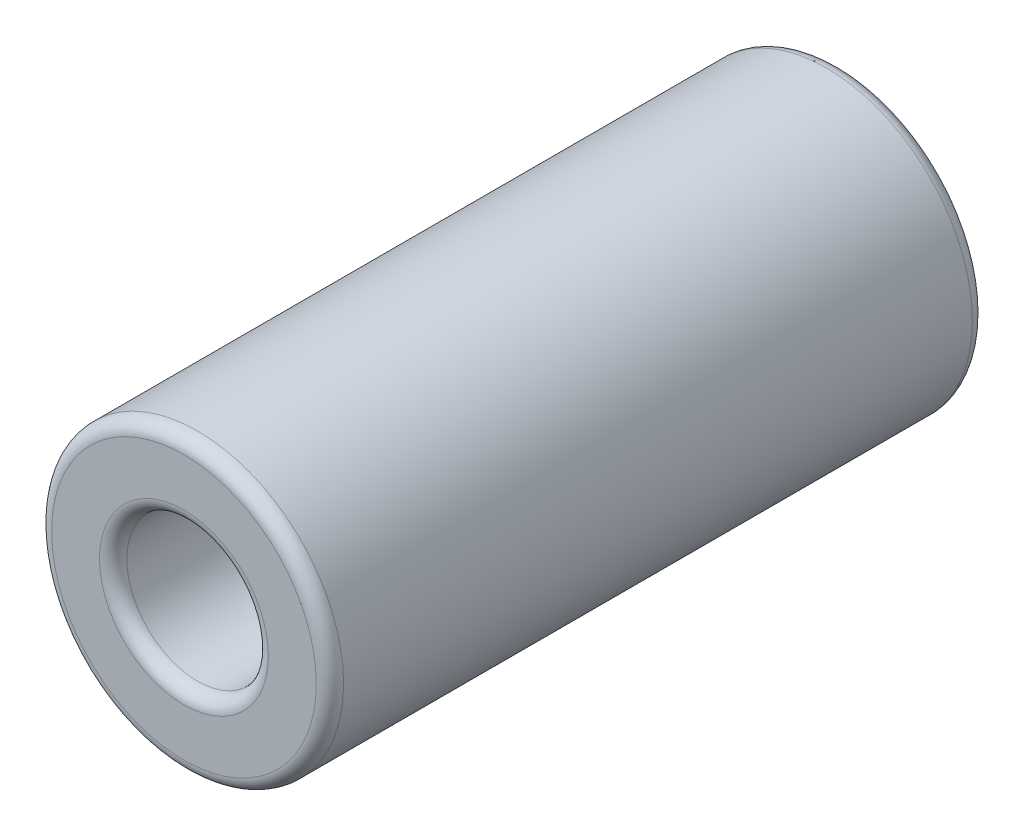
ISO-10303-21;
HEADER;
FILE_DESCRIPTION(('STEP AP214'),'2;1');
FILE_NAME('part.step','',(''),(''),'','','');
FILE_SCHEMA(('AUTOMOTIVE_DESIGN { 1 0 10303 214 1 1 1 1 }'));
ENDSEC;
DATA;
#1=APPLICATION_CONTEXT('core data for automotive mechanical design processes');
#2=APPLICATION_PROTOCOL_DEFINITION('international standard','automotive_design',2000,#1);
#3=PRODUCT_CONTEXT('',#1,'mechanical');
#4=PRODUCT('Part','Part','',(#3));
#5=PRODUCT_RELATED_PRODUCT_CATEGORY('part','',(#4));
#6=PRODUCT_DEFINITION_FORMATION('','',#4);
#7=PRODUCT_DEFINITION_CONTEXT('part definition',#1,'design');
#8=PRODUCT_DEFINITION('design','',#6,#7);
#9=PRODUCT_DEFINITION_SHAPE('','',#8);
#10=(LENGTH_UNIT() NAMED_UNIT(*) SI_UNIT(.MILLI.,.METRE.));
#11=(NAMED_UNIT(*) PLANE_ANGLE_UNIT() SI_UNIT($,.RADIAN.));
#12=(NAMED_UNIT(*) SI_UNIT($,.STERADIAN.) SOLID_ANGLE_UNIT());
#13=UNCERTAINTY_MEASURE_WITH_UNIT(LENGTH_MEASURE(1.E-05),#10,'distance_accuracy_value','');
#14=(GEOMETRIC_REPRESENTATION_CONTEXT(3) GLOBAL_UNCERTAINTY_ASSIGNED_CONTEXT((#13)) GLOBAL_UNIT_ASSIGNED_CONTEXT((#10,
#11,#12)) REPRESENTATION_CONTEXT('',''));
#15=CARTESIAN_POINT('',(0.,0.,0.));
#16=DIRECTION('',(0.,0.,1.));
#17=DIRECTION('',(1.,0.,0.));
#18=AXIS2_PLACEMENT_3D('',#15,#16,#17);
#19=CARTESIAN_POINT('',(2.16493489801906E-12,1.42247325030098E-13,33.5999999999999));
#20=DIRECTION('',(0.,0.,1.));
#21=DIRECTION('',(1.,0.,0.));
#22=AXIS2_PLACEMENT_3D('',#19,#20,#21);
#23=PLANE('',#22);
#24=CARTESIAN_POINT('',(2.16493489801906E-12,1.42247325030098E-13,33.5999999999999));
#25=DIRECTION('',(0.,0.,1.));
#26=DIRECTION('',(1.,0.,0.));
#27=AXIS2_PLACEMENT_3D('',#24,#25,#26);
#28=CIRCLE('',#27,4.325);
#29=CARTESIAN_POINT('',(4.32500000000217,1.42247325030098E-13,33.5999999999999));
#30=VERTEX_POINT('',#29);
#31=EDGE_CURVE('E10',#30,#30,#28,.F.);
#32=ORIENTED_EDGE('',*,*,#31,.T.);
#33=EDGE_LOOP('',(#32));
#34=FACE_BOUND('',#33,.T.);
#35=CARTESIAN_POINT('',(2.16493489801906E-12,1.42247325030098E-13,33.5999999999999));
#36=DIRECTION('',(0.,0.,1.));
#37=DIRECTION('',(1.,0.,0.));
#38=AXIS2_PLACEMENT_3D('',#35,#36,#37);
#39=CIRCLE('',#38,6.775);
#40=CARTESIAN_POINT('',(6.77500000000217,1.42247325030098E-13,33.5999999999999));
#41=VERTEX_POINT('',#40);
#42=EDGE_CURVE('E39',#41,#41,#39,.T.);
#43=ORIENTED_EDGE('',*,*,#42,.T.);
#44=EDGE_LOOP('',(#43));
#45=FACE_BOUND('',#44,.T.);
#46=ADVANCED_FACE('F32',(#34,#45),#23,.T.);
#47=CARTESIAN_POINT('',(2.4980018054066E-12,0.,0.));
#48=DIRECTION('',(0.,0.,1.));
#49=DIRECTION('',(1.,0.,0.));
#50=AXIS2_PLACEMENT_3D('',#47,#48,#49);
#51=PLANE('',#50);
#52=CARTESIAN_POINT('',(2.4980018054066E-12,0.,0.));
#53=DIRECTION('',(0.,0.,1.));
#54=DIRECTION('',(1.,0.,0.));
#55=AXIS2_PLACEMENT_3D('',#52,#53,#54);
#56=CIRCLE('',#55,4.325);
#57=CARTESIAN_POINT('',(4.3250000000025,0.,0.));
#58=VERTEX_POINT('',#57);
#59=EDGE_CURVE('E58',#58,#58,#56,.T.);
#60=ORIENTED_EDGE('',*,*,#59,.T.);
#61=EDGE_LOOP('',(#60));
#62=FACE_BOUND('',#61,.T.);
#63=CARTESIAN_POINT('',(2.4980018054066E-12,0.,0.));
#64=DIRECTION('',(0.,0.,1.));
#65=DIRECTION('',(1.,0.,0.));
#66=AXIS2_PLACEMENT_3D('',#63,#64,#65);
#67=CIRCLE('',#66,6.775);
#68=CARTESIAN_POINT('',(6.77500000000251,0.,0.));
#69=VERTEX_POINT('',#68);
#70=EDGE_CURVE('E61',#69,#69,#67,.F.);
#71=ORIENTED_EDGE('',*,*,#70,.T.);
#72=EDGE_LOOP('',(#71));
#73=FACE_BOUND('',#72,.T.);
#74=ADVANCED_FACE('F65',(#62,#73),#51,.F.);
#75=CARTESIAN_POINT('',(2.16493489801906E-12,1.42247325030098E-13,33.5999999999999));
#76=DIRECTION('',(0.,0.,-1.));
#77=DIRECTION('',(-1.,0.,0.));
#78=AXIS2_PLACEMENT_3D('',#75,#76,#77);
#79=CYLINDRICAL_SURFACE('',#78,7.475);
#80=CARTESIAN_POINT('',(2.4980018054066E-12,0.,0.699999999999978));
#81=DIRECTION('',(0.,0.,1.));
#82=DIRECTION('',(1.,0.,0.));
#83=AXIS2_PLACEMENT_3D('',#80,#81,#82);
#84=CIRCLE('',#83,7.475);
#85=CARTESIAN_POINT('',(7.47500000000251,0.,0.699999999999978));
#86=VERTEX_POINT('',#85);
#87=EDGE_CURVE('E43',#86,#86,#84,.T.);
#88=ORIENTED_EDGE('',*,*,#87,.T.);
#89=EDGE_LOOP('',(#88));
#90=FACE_BOUND('',#89,.T.);
#91=CARTESIAN_POINT('',(2.16493489801906E-12,0.,32.9));
#92=DIRECTION('',(0.,0.,1.));
#93=DIRECTION('',(1.,0.,0.));
#94=AXIS2_PLACEMENT_3D('',#91,#92,#93);
#95=CIRCLE('',#94,7.475);
#96=CARTESIAN_POINT('',(7.47500000000217,0.,32.9));
#97=VERTEX_POINT('',#96);
#98=EDGE_CURVE('E47',#97,#97,#95,.F.);
#99=ORIENTED_EDGE('',*,*,#98,.T.);
#100=EDGE_LOOP('',(#99));
#101=FACE_BOUND('',#100,.T.);
#102=ADVANCED_FACE('F75',(#90,#101),#79,.T.);
#103=CARTESIAN_POINT('',(2.16493489801906E-12,1.42247325030098E-13,33.5999999999999));
#104=DIRECTION('',(0.,0.,-1.));
#105=DIRECTION('',(-1.,0.,0.));
#106=AXIS2_PLACEMENT_3D('',#103,#104,#105);
#107=CYLINDRICAL_SURFACE('',#106,3.625);
#108=CARTESIAN_POINT('',(2.4980018054066E-12,0.,0.699999999999978));
#109=DIRECTION('',(0.,0.,1.));
#110=DIRECTION('',(1.,0.,0.));
#111=AXIS2_PLACEMENT_3D('',#108,#109,#110);
#112=CIRCLE('',#111,3.625);
#113=CARTESIAN_POINT('',(3.6250000000025,0.,0.699999999999978));
#114=VERTEX_POINT('',#113);
#115=EDGE_CURVE('E52',#114,#114,#112,.F.);
#116=ORIENTED_EDGE('',*,*,#115,.T.);
#117=EDGE_LOOP('',(#116));
#118=FACE_BOUND('',#117,.T.);
#119=CARTESIAN_POINT('',(2.16493489801906E-12,0.,32.9));
#120=DIRECTION('',(0.,0.,1.));
#121=DIRECTION('',(1.,0.,0.));
#122=AXIS2_PLACEMENT_3D('',#119,#120,#121);
#123=CIRCLE('',#122,3.625);
#124=CARTESIAN_POINT('',(3.62500000000217,0.,32.9));
#125=VERTEX_POINT('',#124);
#126=EDGE_CURVE('E55',#125,#125,#123,.T.);
#127=ORIENTED_EDGE('',*,*,#126,.T.);
#128=EDGE_LOOP('',(#127));
#129=FACE_BOUND('',#128,.T.);
#130=ADVANCED_FACE('F78',(#118,#129),#107,.F.);
#131=CARTESIAN_POINT('',(2.4980018054066E-12,0.,0.699999999999978));
#132=DIRECTION('',(0.,0.,1.));
#133=DIRECTION('',(1.,0.,0.));
#134=AXIS2_PLACEMENT_3D('',#131,#132,#133);
#135=TOROIDAL_SURFACE('',#134,4.325,0.7);
#136=ORIENTED_EDGE('',*,*,#115,.F.);
#137=EDGE_LOOP('',(#136));
#138=FACE_BOUND('',#137,.T.);
#139=ORIENTED_EDGE('',*,*,#59,.F.);
#140=EDGE_LOOP('',(#139));
#141=FACE_BOUND('',#140,.T.);
#142=ADVANCED_FACE('F71',(#138,#141),#135,.T.);
#143=CARTESIAN_POINT('',(2.4980018054066E-12,0.,0.699999999999978));
#144=DIRECTION('',(0.,0.,1.));
#145=DIRECTION('',(1.,0.,0.));
#146=AXIS2_PLACEMENT_3D('',#143,#144,#145);
#147=TOROIDAL_SURFACE('',#146,6.775,0.7);
#148=ORIENTED_EDGE('',*,*,#70,.F.);
#149=EDGE_LOOP('',(#148));
#150=FACE_BOUND('',#149,.T.);
#151=ORIENTED_EDGE('',*,*,#87,.F.);
#152=EDGE_LOOP('',(#151));
#153=FACE_BOUND('',#152,.T.);
#154=ADVANCED_FACE('F67',(#150,#153),#147,.T.);
#155=CARTESIAN_POINT('',(2.16493489801906E-12,0.,32.9));
#156=DIRECTION('',(0.,0.,1.));
#157=DIRECTION('',(1.,0.,0.));
#158=AXIS2_PLACEMENT_3D('',#155,#156,#157);
#159=TOROIDAL_SURFACE('',#158,4.325,0.7);
#160=ORIENTED_EDGE('',*,*,#31,.F.);
#161=EDGE_LOOP('',(#160));
#162=FACE_BOUND('',#161,.T.);
#163=ORIENTED_EDGE('',*,*,#126,.F.);
#164=EDGE_LOOP('',(#163));
#165=FACE_BOUND('',#164,.T.);
#166=ADVANCED_FACE('F70',(#162,#165),#159,.T.);
#167=CARTESIAN_POINT('',(2.16493489801906E-12,0.,32.9));
#168=DIRECTION('',(0.,0.,1.));
#169=DIRECTION('',(1.,0.,0.));
#170=AXIS2_PLACEMENT_3D('',#167,#168,#169);
#171=TOROIDAL_SURFACE('',#170,6.775,0.7);
#172=ORIENTED_EDGE('',*,*,#98,.F.);
#173=EDGE_LOOP('',(#172));
#174=FACE_BOUND('',#173,.T.);
#175=ORIENTED_EDGE('',*,*,#42,.F.);
#176=EDGE_LOOP('',(#175));
#177=FACE_BOUND('',#176,.T.);
#178=ADVANCED_FACE('F34',(#174,#177),#171,.T.);
#179=CLOSED_SHELL('',(#46,#74,#102,#130,#142,#154,#166,#178));
#180=MANIFOLD_SOLID_BREP('B2',#179);
#181=ADVANCED_BREP_SHAPE_REPRESENTATION('',(#18,#180),#14);
#182=SHAPE_DEFINITION_REPRESENTATION(#9,#181);
ENDSEC;
END-ISO-10303-21;
